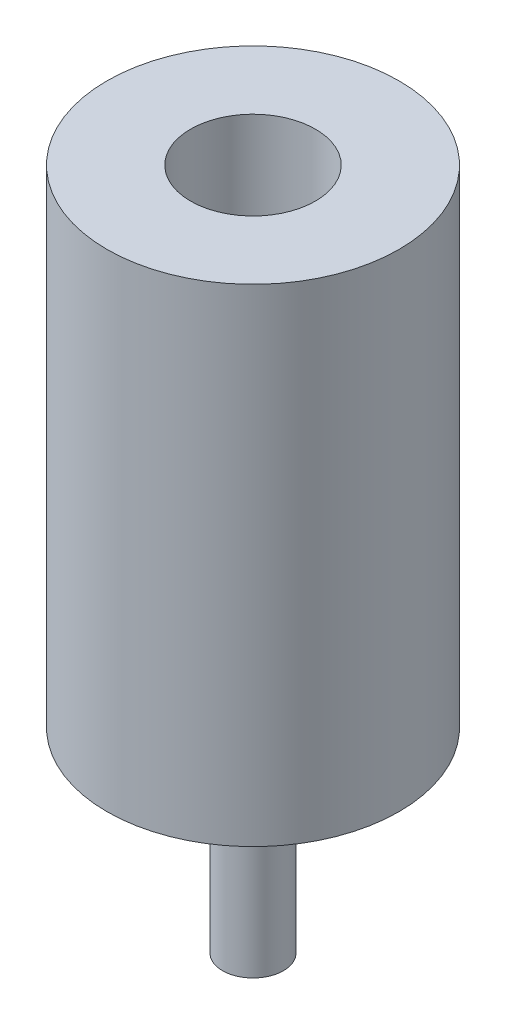
ISO-10303-21;
HEADER;
FILE_DESCRIPTION(('STEP AP214'),'2;1');
FILE_NAME('part.step','',(''),(''),'','','');
FILE_SCHEMA(('AUTOMOTIVE_DESIGN { 1 0 10303 214 1 1 1 1 }'));
ENDSEC;
DATA;
#1=APPLICATION_CONTEXT('core data for automotive mechanical design processes');
#2=APPLICATION_PROTOCOL_DEFINITION('international standard','automotive_design',2000,#1);
#3=PRODUCT_CONTEXT('',#1,'mechanical');
#4=PRODUCT('Part','Part','',(#3));
#5=PRODUCT_RELATED_PRODUCT_CATEGORY('part','',(#4));
#6=PRODUCT_DEFINITION_FORMATION('','',#4);
#7=PRODUCT_DEFINITION_CONTEXT('part definition',#1,'design');
#8=PRODUCT_DEFINITION('design','',#6,#7);
#9=PRODUCT_DEFINITION_SHAPE('','',#8);
#10=(LENGTH_UNIT() NAMED_UNIT(*) SI_UNIT(.MILLI.,.METRE.));
#11=(NAMED_UNIT(*) PLANE_ANGLE_UNIT() SI_UNIT($,.RADIAN.));
#12=(NAMED_UNIT(*) SI_UNIT($,.STERADIAN.) SOLID_ANGLE_UNIT());
#13=UNCERTAINTY_MEASURE_WITH_UNIT(LENGTH_MEASURE(1.E-05),#10,'distance_accuracy_value','');
#14=(GEOMETRIC_REPRESENTATION_CONTEXT(3) GLOBAL_UNCERTAINTY_ASSIGNED_CONTEXT((#13)) GLOBAL_UNIT_ASSIGNED_CONTEXT((#10,
#11,#12)) REPRESENTATION_CONTEXT('',''));
#15=CARTESIAN_POINT('',(0.,0.,0.));
#16=DIRECTION('',(0.,0.,1.));
#17=DIRECTION('',(1.,0.,0.));
#18=AXIS2_PLACEMENT_3D('',#15,#16,#17);
#19=CARTESIAN_POINT('',(0.,7.92,0.));
#20=DIRECTION('',(0.,-1.,0.));
#21=DIRECTION('',(0.,0.,-1.));
#22=AXIS2_PLACEMENT_3D('',#19,#20,#21);
#23=CYLINDRICAL_SURFACE('',#22,2.375);
#24=CARTESIAN_POINT('',(0.,7.92,0.));
#25=DIRECTION('',(0.,1.,0.));
#26=DIRECTION('',(0.,0.,1.));
#27=AXIS2_PLACEMENT_3D('',#24,#25,#26);
#28=CIRCLE('',#27,2.375);
#29=CARTESIAN_POINT('',(0.,7.92,2.375));
#30=VERTEX_POINT('',#29);
#31=EDGE_CURVE('E41',#30,#30,#28,.T.);
#32=ORIENTED_EDGE('',*,*,#31,.F.);
#33=EDGE_LOOP('',(#32));
#34=FACE_BOUND('',#33,.T.);
#35=CARTESIAN_POINT('',(0.,0.,0.));
#36=DIRECTION('',(0.,1.,0.));
#37=DIRECTION('',(0.,0.,1.));
#38=AXIS2_PLACEMENT_3D('',#35,#36,#37);
#39=CIRCLE('',#38,2.375);
#40=CARTESIAN_POINT('',(0.,0.,2.375));
#41=VERTEX_POINT('',#40);
#42=EDGE_CURVE('E48',#41,#41,#39,.T.);
#43=ORIENTED_EDGE('',*,*,#42,.T.);
#44=EDGE_LOOP('',(#43));
#45=FACE_BOUND('',#44,.T.);
#46=ADVANCED_FACE('F34',(#34,#45),#23,.T.);
#47=CARTESIAN_POINT('',(0.,7.92,0.));
#48=DIRECTION('',(0.,1.,0.));
#49=DIRECTION('',(0.,0.,1.));
#50=AXIS2_PLACEMENT_3D('',#47,#48,#49);
#51=PLANE('',#50);
#52=CARTESIAN_POINT('',(0.,7.92,0.));
#53=DIRECTION('',(0.,1.,0.));
#54=DIRECTION('',(0.,0.,1.));
#55=AXIS2_PLACEMENT_3D('',#52,#53,#54);
#56=CIRCLE('',#55,1.015);
#57=CARTESIAN_POINT('',(0.,7.92,1.015));
#58=VERTEX_POINT('',#57);
#59=EDGE_CURVE('E60',#58,#58,#56,.T.);
#60=ORIENTED_EDGE('',*,*,#59,.F.);
#61=EDGE_LOOP('',(#60));
#62=FACE_BOUND('',#61,.T.);
#63=ORIENTED_EDGE('',*,*,#31,.T.);
#64=EDGE_LOOP('',(#63));
#65=FACE_BOUND('',#64,.T.);
#66=ADVANCED_FACE('F75',(#62,#65),#51,.T.);
#67=CARTESIAN_POINT('',(0.,0.,0.));
#68=DIRECTION('',(0.,1.,0.));
#69=DIRECTION('',(0.,0.,1.));
#70=AXIS2_PLACEMENT_3D('',#67,#68,#69);
#71=PLANE('',#70);
#72=CARTESIAN_POINT('',(0.,0.,0.));
#73=DIRECTION('',(0.,1.,0.));
#74=DIRECTION('',(0.,0.,1.));
#75=AXIS2_PLACEMENT_3D('',#72,#73,#74);
#76=CIRCLE('',#75,0.495000026);
#77=CARTESIAN_POINT('',(0.,0.,0.495000026));
#78=VERTEX_POINT('',#77);
#79=EDGE_CURVE('E10',#78,#78,#76,.F.);
#80=ORIENTED_EDGE('',*,*,#79,.F.);
#81=EDGE_LOOP('',(#80));
#82=FACE_BOUND('',#81,.T.);
#83=ORIENTED_EDGE('',*,*,#42,.F.);
#84=EDGE_LOOP('',(#83));
#85=FACE_BOUND('',#84,.T.);
#86=ADVANCED_FACE('F77',(#82,#85),#71,.F.);
#87=CARTESIAN_POINT('',(0.,-3.18,0.));
#88=DIRECTION('',(0.,1.,0.));
#89=DIRECTION('',(0.,0.,1.));
#90=AXIS2_PLACEMENT_3D('',#87,#88,#89);
#91=CYLINDRICAL_SURFACE('',#90,0.495000026);
#92=CARTESIAN_POINT('',(0.,-3.18,0.));
#93=DIRECTION('',(0.,-1.,0.));
#94=DIRECTION('',(0.,0.,-1.));
#95=AXIS2_PLACEMENT_3D('',#92,#93,#94);
#96=CIRCLE('',#95,0.495000026);
#97=CARTESIAN_POINT('',(0.,-3.18,-0.495000026));
#98=VERTEX_POINT('',#97);
#99=EDGE_CURVE('E54',#98,#98,#96,.T.);
#100=ORIENTED_EDGE('',*,*,#99,.F.);
#101=EDGE_LOOP('',(#100));
#102=FACE_BOUND('',#101,.T.);
#103=ORIENTED_EDGE('',*,*,#79,.T.);
#104=EDGE_LOOP('',(#103));
#105=FACE_BOUND('',#104,.T.);
#106=ADVANCED_FACE('F83',(#102,#105),#91,.T.);
#107=CARTESIAN_POINT('',(0.,-3.18,0.));
#108=DIRECTION('',(0.,-1.,0.));
#109=DIRECTION('',(0.,0.,-1.));
#110=AXIS2_PLACEMENT_3D('',#107,#108,#109);
#111=PLANE('',#110);
#112=ORIENTED_EDGE('',*,*,#99,.T.);
#113=EDGE_LOOP('',(#112));
#114=FACE_BOUND('',#113,.T.);
#115=ADVANCED_FACE('F71',(#114),#111,.T.);
#116=CARTESIAN_POINT('',(0.,1.57,0.));
#117=DIRECTION('',(0.,1.,0.));
#118=DIRECTION('',(0.,0.,1.));
#119=AXIS2_PLACEMENT_3D('',#116,#117,#118);
#120=CYLINDRICAL_SURFACE('',#119,1.015);
#121=CARTESIAN_POINT('',(0.,1.57,0.));
#122=DIRECTION('',(0.,1.,0.));
#123=DIRECTION('',(0.,0.,1.));
#124=AXIS2_PLACEMENT_3D('',#121,#122,#123);
#125=CIRCLE('',#124,1.015);
#126=CARTESIAN_POINT('',(0.,1.57,1.015));
#127=VERTEX_POINT('',#126);
#128=EDGE_CURVE('E59',#127,#127,#125,.T.);
#129=ORIENTED_EDGE('',*,*,#128,.F.);
#130=EDGE_LOOP('',(#129));
#131=FACE_BOUND('',#130,.T.);
#132=ORIENTED_EDGE('',*,*,#59,.T.);
#133=EDGE_LOOP('',(#132));
#134=FACE_BOUND('',#133,.T.);
#135=ADVANCED_FACE('F68',(#131,#134),#120,.F.);
#136=CARTESIAN_POINT('',(0.,1.57,0.));
#137=DIRECTION('',(0.,1.,0.));
#138=DIRECTION('',(0.,0.,1.));
#139=AXIS2_PLACEMENT_3D('',#136,#137,#138);
#140=PLANE('',#139);
#141=ORIENTED_EDGE('',*,*,#128,.T.);
#142=EDGE_LOOP('',(#141));
#143=FACE_BOUND('',#142,.T.);
#144=ADVANCED_FACE('F66',(#143),#140,.T.);
#145=CLOSED_SHELL('',(#46,#66,#86,#106,#115,#135,#144));
#146=MANIFOLD_SOLID_BREP('B2',#145);
#147=ADVANCED_BREP_SHAPE_REPRESENTATION('',(#18,#146),#14);
#148=SHAPE_DEFINITION_REPRESENTATION(#9,#147);
ENDSEC;
END-ISO-10303-21;
